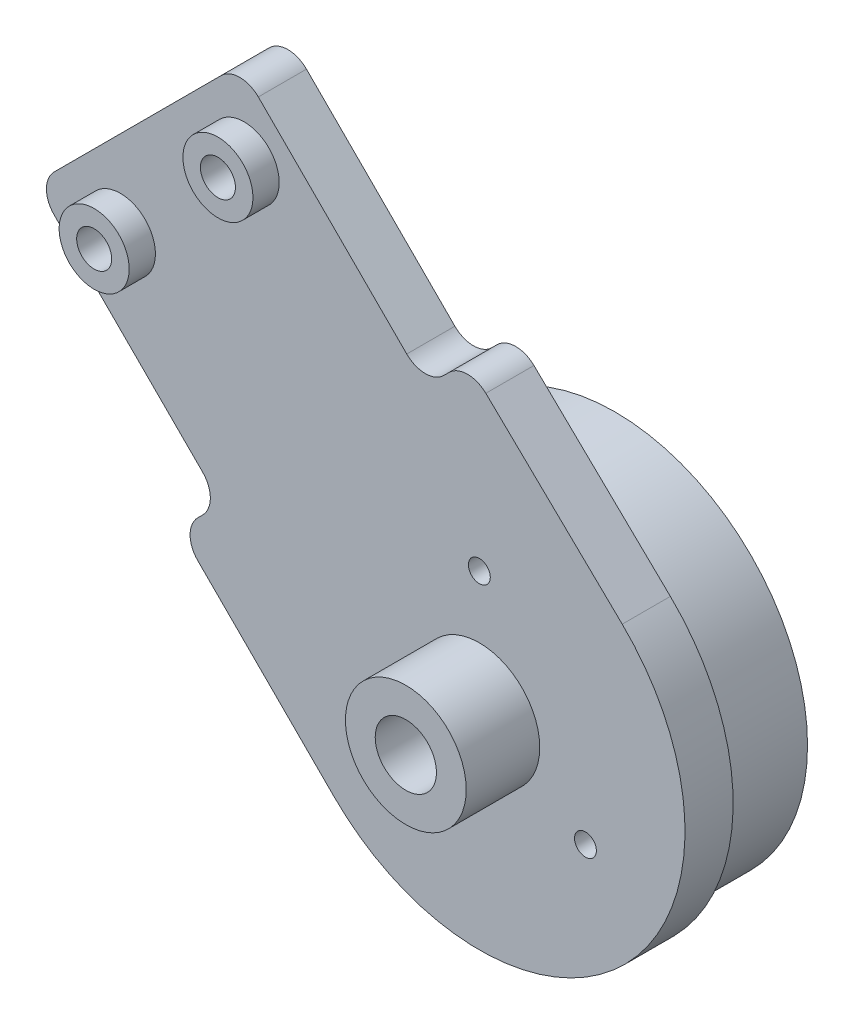
ISO-10303-21;
HEADER;
FILE_DESCRIPTION(('STEP AP214'),'2;1');
FILE_NAME('part.step','',(''),(''),'','','');
FILE_SCHEMA(('AUTOMOTIVE_DESIGN { 1 0 10303 214 1 1 1 1 }'));
ENDSEC;
DATA;
#1=APPLICATION_CONTEXT('core data for automotive mechanical design processes');
#2=APPLICATION_PROTOCOL_DEFINITION('international standard','automotive_design',2000,#1);
#3=PRODUCT_CONTEXT('',#1,'mechanical');
#4=PRODUCT('Part','Part','',(#3));
#5=PRODUCT_RELATED_PRODUCT_CATEGORY('part','',(#4));
#6=PRODUCT_DEFINITION_FORMATION('','',#4);
#7=PRODUCT_DEFINITION_CONTEXT('part definition',#1,'design');
#8=PRODUCT_DEFINITION('design','',#6,#7);
#9=PRODUCT_DEFINITION_SHAPE('','',#8);
#10=(LENGTH_UNIT() NAMED_UNIT(*) SI_UNIT(.MILLI.,.METRE.));
#11=(NAMED_UNIT(*) PLANE_ANGLE_UNIT() SI_UNIT($,.RADIAN.));
#12=(NAMED_UNIT(*) SI_UNIT($,.STERADIAN.) SOLID_ANGLE_UNIT());
#13=UNCERTAINTY_MEASURE_WITH_UNIT(LENGTH_MEASURE(1.E-05),#10,'distance_accuracy_value','');
#14=(GEOMETRIC_REPRESENTATION_CONTEXT(3) GLOBAL_UNCERTAINTY_ASSIGNED_CONTEXT((#13)) GLOBAL_UNIT_ASSIGNED_CONTEXT((#10,
#11,#12)) REPRESENTATION_CONTEXT('',''));
#15=CARTESIAN_POINT('',(0.,0.,0.));
#16=DIRECTION('',(0.,0.,1.));
#17=DIRECTION('',(1.,0.,0.));
#18=AXIS2_PLACEMENT_3D('',#15,#16,#17);
#19=CARTESIAN_POINT('',(0.,0.,2.75));
#20=DIRECTION('',(0.,0.,1.));
#21=DIRECTION('',(1.,0.,0.));
#22=AXIS2_PLACEMENT_3D('',#19,#20,#21);
#23=PLANE('',#22);
#24=CARTESIAN_POINT('',(100.,7.00000000000003,2.75));
#25=DIRECTION('',(0.,0.,1.));
#26=DIRECTION('',(1.,0.,0.));
#27=AXIS2_PLACEMENT_3D('',#24,#25,#26);
#28=CIRCLE('',#27,0.625000000000006);
#29=CARTESIAN_POINT('',(100.625,7.00000000000003,2.75));
#30=VERTEX_POINT('',#29);
#31=EDGE_CURVE('E237',#30,#30,#28,.T.);
#32=ORIENTED_EDGE('',*,*,#31,.F.);
#33=EDGE_LOOP('',(#32));
#34=FACE_BOUND('',#33,.T.);
#35=CARTESIAN_POINT('',(106.062177826491,-3.49999999999979,2.75));
#36=DIRECTION('',(0.,0.,1.));
#37=DIRECTION('',(1.,0.,0.));
#38=AXIS2_PLACEMENT_3D('',#35,#36,#37);
#39=CIRCLE('',#38,0.62500000000002);
#40=CARTESIAN_POINT('',(106.687177826491,-3.49999999999979,2.75));
#41=VERTEX_POINT('',#40);
#42=EDGE_CURVE('E540',#41,#41,#39,.T.);
#43=ORIENTED_EDGE('',*,*,#42,.F.);
#44=EDGE_LOOP('',(#43));
#45=FACE_BOUND('',#44,.T.);
#46=CARTESIAN_POINT('',(93.9378221735093,-3.50000000000014,2.75));
#47=DIRECTION('',(0.,0.,1.));
#48=DIRECTION('',(1.,0.,0.));
#49=AXIS2_PLACEMENT_3D('',#46,#47,#48);
#50=CIRCLE('',#49,0.624999999999991);
#51=CARTESIAN_POINT('',(94.5628221735093,-3.50000000000014,2.75));
#52=VERTEX_POINT('',#51);
#53=EDGE_CURVE('E254',#52,#52,#50,.T.);
#54=ORIENTED_EDGE('',*,*,#53,.F.);
#55=EDGE_LOOP('',(#54));
#56=FACE_BOUND('',#55,.T.);
#57=CARTESIAN_POINT('',(86.5649711574558,20.5060966544101,2.75));
#58=DIRECTION('',(0.,0.,1.));
#59=DIRECTION('',(1.,0.,0.));
#60=AXIS2_PLACEMENT_3D('',#57,#58,#59);
#61=CIRCLE('',#60,2.);
#62=CARTESIAN_POINT('',(88.5649711574558,20.5060966544101,2.75));
#63=VERTEX_POINT('',#62);
#64=EDGE_CURVE('E260',#63,#63,#61,.T.);
#65=ORIENTED_EDGE('',*,*,#64,.F.);
#66=EDGE_LOOP('',(#65));
#67=FACE_BOUND('',#66,.T.);
#68=DIRECTION('',(-0.707106781186544,-0.707106781186551,0.));
#69=VECTOR('',#68,1.);
#70=CARTESIAN_POINT('',(41.1611652351685,-41.1611652351681,2.75));
#71=LINE('',#70,#69);
#72=CARTESIAN_POINT('',(84.1907991641736,1.86846869383737,2.75));
#73=VERTEX_POINT('',#72);
#74=CARTESIAN_POINT('',(83.9133207280061,1.59099025766978,2.75));
#75=VERTEX_POINT('',#74);
#76=EDGE_CURVE('E179',#73,#75,#71,.T.);
#77=ORIENTED_EDGE('',*,*,#76,.T.);
#78=CARTESIAN_POINT('',(84.9739808997859,0.530330085889964,2.75));
#79=DIRECTION('',(0.,0.,1.));
#80=DIRECTION('',(1.,0.,0.));
#81=AXIS2_PLACEMENT_3D('',#78,#79,#80);
#82=CIRCLE('',#81,1.5);
#83=CARTESIAN_POINT('',(83.913320728006,-0.53033008588986,2.75));
#84=VERTEX_POINT('',#83);
#85=EDGE_CURVE('E154',#75,#84,#82,.T.);
#86=ORIENTED_EDGE('',*,*,#85,.T.);
#87=DIRECTION('',(0.707106781186547,-0.707106781186548,0.));
#88=VECTOR('',#87,1.);
#89=CARTESIAN_POINT('',(41.6914953210581,41.6914953210581,2.75));
#90=LINE('',#89,#88);
#91=CARTESIAN_POINT('',(91.6914953210581,-8.30850467894189,2.75));
#92=VERTEX_POINT('',#91);
#93=EDGE_CURVE('E146',#84,#92,#90,.T.);
#94=ORIENTED_EDGE('',*,*,#93,.T.);
#95=CARTESIAN_POINT('',(100.,0.,2.75));
#96=DIRECTION('',(0.,0.,1.));
#97=DIRECTION('',(1.,0.,0.));
#98=AXIS2_PLACEMENT_3D('',#95,#96,#97);
#99=CIRCLE('',#98,11.75);
#100=CARTESIAN_POINT('',(108.163262954966,8.45125067242009,2.75));
#101=VERTEX_POINT('',#100);
#102=EDGE_CURVE('E151',#92,#101,#99,.T.);
#103=ORIENTED_EDGE('',*,*,#102,.T.);
#104=DIRECTION('',(0.719255376376175,-0.694745783401358,0.));
#105=VECTOR('',#104,1.);
#106=CARTESIAN_POINT('',(56.4304333103627,58.4212146650305,2.75));
#107=LINE('',#106,#105);
#108=CARTESIAN_POINT('',(100.370597127916,15.9783709451608,2.75));
#109=VERTEX_POINT('',#108);
#110=EDGE_CURVE('E168',#109,#101,#107,.T.);
#111=ORIENTED_EDGE('',*,*,#110,.F.);
#112=CARTESIAN_POINT('',(99.3284784528139,14.8994878805966,2.75));
#113=DIRECTION('',(0.,0.,1.));
#114=DIRECTION('',(1.,0.,0.));
#115=AXIS2_PLACEMENT_3D('',#112,#113,#114);
#116=CIRCLE('',#115,1.5);
#117=CARTESIAN_POINT('',(98.2620899578572,15.9543886237112,2.75));
#118=VERTEX_POINT('',#117);
#119=EDGE_CURVE('E197',#109,#118,#116,.T.);
#120=ORIENTED_EDGE('',*,*,#119,.T.);
#121=DIRECTION('',(0.703267162076436,0.710925663304509,0.));
#122=VECTOR('',#121,1.);
#123=CARTESIAN_POINT('',(41.6864371230131,-41.2373667822174,2.75));
#124=LINE('',#123,#122);
#125=CARTESIAN_POINT('',(97.9793502073653,15.6685698687626,2.75));
#126=VERTEX_POINT('',#125);
#127=EDGE_CURVE('E286',#126,#118,#124,.T.);
#128=ORIENTED_EDGE('',*,*,#127,.F.);
#129=CARTESIAN_POINT('',(96.9129617124085,16.7234706118772,2.75));
#130=DIRECTION('',(0.,0.,1.));
#131=DIRECTION('',(1.,0.,0.));
#132=AXIS2_PLACEMENT_3D('',#129,#130,#131);
#133=CIRCLE('',#132,1.5);
#134=CARTESIAN_POINT('',(95.8523015406287,15.6628104400974,2.75));
#135=VERTEX_POINT('',#134);
#136=EDGE_CURVE('E12',#126,#135,#133,.F.);
#137=ORIENTED_EDGE('',*,*,#136,.T.);
#138=DIRECTION('',(0.707106781186547,-0.707106781186548,0.));
#139=VECTOR('',#138,1.);
#140=CARTESIAN_POINT('',(55.7575559903631,55.757555990363,2.75));
#141=LINE('',#140,#139);
#142=CARTESIAN_POINT('',(87.3727796795128,24.1423323012133,2.75));
#143=VERTEX_POINT('',#142);
#144=EDGE_CURVE('E289',#143,#135,#141,.T.);
#145=ORIENTED_EDGE('',*,*,#144,.F.);
#146=CARTESIAN_POINT('',(86.312119507733,23.0816721294335,2.75));
#147=DIRECTION('',(0.,0.,1.));
#148=DIRECTION('',(1.,0.,0.));
#149=AXIS2_PLACEMENT_3D('',#146,#147,#148);
#150=CIRCLE('',#149,1.5);
#151=CARTESIAN_POINT('',(85.2514593359532,24.1423323012133,2.75));
#152=VERTEX_POINT('',#151);
#153=EDGE_CURVE('E199',#143,#152,#150,.T.);
#154=ORIENTED_EDGE('',*,*,#153,.T.);
#155=DIRECTION('',(0.707106781186547,0.707106781186548,0.));
#156=VECTOR('',#155,1.);
#157=CARTESIAN_POINT('',(30.55456351737,-30.55456351737,2.75));
#158=LINE('',#157,#156);
#159=CARTESIAN_POINT('',(75.7055177899351,14.5963907551952,2.75));
#160=VERTEX_POINT('',#159);
#161=EDGE_CURVE('E292',#160,#152,#158,.T.);
#162=ORIENTED_EDGE('',*,*,#161,.F.);
#163=CARTESIAN_POINT('',(76.7661779617149,13.5357305834154,2.75));
#164=DIRECTION('',(0.,0.,1.));
#165=DIRECTION('',(1.,0.,0.));
#166=AXIS2_PLACEMENT_3D('',#163,#164,#165);
#167=CIRCLE('',#166,1.5);
#168=CARTESIAN_POINT('',(75.7055177899351,12.4750704116355,2.75));
#169=VERTEX_POINT('',#168);
#170=EDGE_CURVE('E60',#160,#169,#167,.T.);
#171=ORIENTED_EDGE('',*,*,#170,.T.);
#172=DIRECTION('',(-0.707106781186547,0.707106781186548,0.));
#173=VECTOR('',#172,1.);
#174=CARTESIAN_POINT('',(44.0902941007854,44.0902941007853,2.75));
#175=LINE('',#174,#173);
#176=CARTESIAN_POINT('',(84.1907991641736,3.989789037397,2.75));
#177=VERTEX_POINT('',#176);
#178=EDGE_CURVE('E295',#177,#169,#175,.T.);
#179=ORIENTED_EDGE('',*,*,#178,.F.);
#180=CARTESIAN_POINT('',(83.1301389923938,2.92912886561718,2.75));
#181=DIRECTION('',(0.,0.,1.));
#182=DIRECTION('',(1.,0.,0.));
#183=AXIS2_PLACEMENT_3D('',#180,#181,#182);
#184=CIRCLE('',#183,1.5);
#185=EDGE_CURVE('E226',#177,#73,#184,.F.);
#186=ORIENTED_EDGE('',*,*,#185,.T.);
#187=EDGE_LOOP('',(#77,#86,#94,#103,#111,#120,#128,#137,#145,#154,#162,#171,#179,#186));
#188=FACE_BOUND('',#187,.T.);
#189=CARTESIAN_POINT('',(79.4939033455903,13.4350288425446,2.75));
#190=DIRECTION('',(0.,0.,1.));
#191=DIRECTION('',(1.,0.,0.));
#192=AXIS2_PLACEMENT_3D('',#189,#190,#191);
#193=CIRCLE('',#192,2.);
#194=CARTESIAN_POINT('',(81.4939033455903,13.4350288425446,2.75));
#195=VERTEX_POINT('',#194);
#196=EDGE_CURVE('E269',#195,#195,#193,.T.);
#197=ORIENTED_EDGE('',*,*,#196,.F.);
#198=EDGE_LOOP('',(#197));
#199=FACE_BOUND('',#198,.T.);
#200=CARTESIAN_POINT('',(100.,0.,2.75));
#201=DIRECTION('',(0.,0.,1.));
#202=DIRECTION('',(1.,0.,0.));
#203=AXIS2_PLACEMENT_3D('',#200,#201,#202);
#204=CIRCLE('',#203,3.45);
#205=CARTESIAN_POINT('',(103.45,0.,2.75));
#206=VERTEX_POINT('',#205);
#207=EDGE_CURVE('E246',#206,#206,#204,.T.);
#208=ORIENTED_EDGE('',*,*,#207,.F.);
#209=EDGE_LOOP('',(#208));
#210=FACE_BOUND('',#209,.T.);
#211=ADVANCED_FACE('F43',(#34,#45,#56,#67,#188,#199,#210),#23,.T.);
#212=CARTESIAN_POINT('',(0.,0.,0.));
#213=DIRECTION('',(0.,0.,1.));
#214=DIRECTION('',(1.,0.,0.));
#215=AXIS2_PLACEMENT_3D('',#212,#213,#214);
#216=PLANE('',#215);
#217=DIRECTION('',(0.707106781186547,-0.707106781186548,0.));
#218=VECTOR('',#217,1.);
#219=CARTESIAN_POINT('',(41.6914953210581,41.6914953210581,0.));
#220=LINE('',#219,#218);
#221=CARTESIAN_POINT('',(83.913320728006,-0.53033008588986,0.));
#222=VERTEX_POINT('',#221);
#223=CARTESIAN_POINT('',(91.6914953210581,-8.30850467894189,0.));
#224=VERTEX_POINT('',#223);
#225=EDGE_CURVE('E172',#222,#224,#220,.T.);
#226=ORIENTED_EDGE('',*,*,#225,.F.);
#227=CARTESIAN_POINT('',(84.9739808997859,0.530330085889964,0.));
#228=DIRECTION('',(0.,0.,1.));
#229=DIRECTION('',(1.,0.,0.));
#230=AXIS2_PLACEMENT_3D('',#227,#228,#229);
#231=CIRCLE('',#230,1.5);
#232=CARTESIAN_POINT('',(83.9133207280061,1.59099025766978,0.));
#233=VERTEX_POINT('',#232);
#234=EDGE_CURVE('E190',#222,#233,#231,.F.);
#235=ORIENTED_EDGE('',*,*,#234,.T.);
#236=DIRECTION('',(-0.707106781186544,-0.707106781186551,0.));
#237=VECTOR('',#236,1.);
#238=CARTESIAN_POINT('',(41.1611652351685,-41.1611652351681,0.));
#239=LINE('',#238,#237);
#240=CARTESIAN_POINT('',(84.1907991641736,1.86846869383737,0.));
#241=VERTEX_POINT('',#240);
#242=EDGE_CURVE('E159',#241,#233,#239,.T.);
#243=ORIENTED_EDGE('',*,*,#242,.F.);
#244=CARTESIAN_POINT('',(83.1301389923938,2.92912886561718,0.));
#245=DIRECTION('',(0.,0.,1.));
#246=DIRECTION('',(1.,0.,0.));
#247=AXIS2_PLACEMENT_3D('',#244,#245,#246);
#248=CIRCLE('',#247,1.5);
#249=CARTESIAN_POINT('',(84.1907991641736,3.989789037397,0.));
#250=VERTEX_POINT('',#249);
#251=EDGE_CURVE('E224',#241,#250,#248,.T.);
#252=ORIENTED_EDGE('',*,*,#251,.T.);
#253=DIRECTION('',(-0.707106781186547,0.707106781186548,0.));
#254=VECTOR('',#253,1.);
#255=CARTESIAN_POINT('',(44.0902941007854,44.0902941007853,0.));
#256=LINE('',#255,#254);
#257=CARTESIAN_POINT('',(75.7055177899351,12.4750704116355,0.));
#258=VERTEX_POINT('',#257);
#259=EDGE_CURVE('E317',#250,#258,#256,.T.);
#260=ORIENTED_EDGE('',*,*,#259,.T.);
#261=CARTESIAN_POINT('',(76.7661779617149,13.5357305834154,0.));
#262=DIRECTION('',(0.,0.,1.));
#263=DIRECTION('',(1.,0.,0.));
#264=AXIS2_PLACEMENT_3D('',#261,#262,#263);
#265=CIRCLE('',#264,1.5);
#266=CARTESIAN_POINT('',(75.7055177899351,14.5963907551952,0.));
#267=VERTEX_POINT('',#266);
#268=EDGE_CURVE('E188',#258,#267,#265,.F.);
#269=ORIENTED_EDGE('',*,*,#268,.T.);
#270=DIRECTION('',(0.707106781186547,0.707106781186548,0.));
#271=VECTOR('',#270,1.);
#272=CARTESIAN_POINT('',(30.55456351737,-30.55456351737,0.));
#273=LINE('',#272,#271);
#274=CARTESIAN_POINT('',(85.2514593359532,24.1423323012133,0.));
#275=VERTEX_POINT('',#274);
#276=EDGE_CURVE('E314',#267,#275,#273,.T.);
#277=ORIENTED_EDGE('',*,*,#276,.T.);
#278=CARTESIAN_POINT('',(86.312119507733,23.0816721294335,0.));
#279=DIRECTION('',(0.,0.,1.));
#280=DIRECTION('',(1.,0.,0.));
#281=AXIS2_PLACEMENT_3D('',#278,#279,#280);
#282=CIRCLE('',#281,1.5);
#283=CARTESIAN_POINT('',(87.3727796795128,24.1423323012133,0.));
#284=VERTEX_POINT('',#283);
#285=EDGE_CURVE('E186',#275,#284,#282,.F.);
#286=ORIENTED_EDGE('',*,*,#285,.T.);
#287=DIRECTION('',(0.707106781186547,-0.707106781186548,0.));
#288=VECTOR('',#287,1.);
#289=CARTESIAN_POINT('',(55.7575559903631,55.757555990363,0.));
#290=LINE('',#289,#288);
#291=CARTESIAN_POINT('',(95.8523015406287,15.6628104400974,0.));
#292=VERTEX_POINT('',#291);
#293=EDGE_CURVE('E311',#284,#292,#290,.T.);
#294=ORIENTED_EDGE('',*,*,#293,.T.);
#295=CARTESIAN_POINT('',(96.9129617124085,16.7234706118772,0.));
#296=DIRECTION('',(0.,0.,1.));
#297=DIRECTION('',(1.,0.,0.));
#298=AXIS2_PLACEMENT_3D('',#295,#296,#297);
#299=CIRCLE('',#298,1.5);
#300=CARTESIAN_POINT('',(97.9793502073653,15.6685698687626,0.));
#301=VERTEX_POINT('',#300);
#302=EDGE_CURVE('E52',#292,#301,#299,.T.);
#303=ORIENTED_EDGE('',*,*,#302,.T.);
#304=DIRECTION('',(0.703267162076436,0.710925663304509,0.));
#305=VECTOR('',#304,1.);
#306=CARTESIAN_POINT('',(41.6864371230131,-41.2373667822174,0.));
#307=LINE('',#306,#305);
#308=CARTESIAN_POINT('',(98.2620899578572,15.9543886237112,0.));
#309=VERTEX_POINT('',#308);
#310=EDGE_CURVE('E308',#301,#309,#307,.T.);
#311=ORIENTED_EDGE('',*,*,#310,.T.);
#312=CARTESIAN_POINT('',(99.3284784528139,14.8994878805966,0.));
#313=DIRECTION('',(0.,0.,1.));
#314=DIRECTION('',(1.,0.,0.));
#315=AXIS2_PLACEMENT_3D('',#312,#313,#314);
#316=CIRCLE('',#315,1.5);
#317=CARTESIAN_POINT('',(100.370597127916,15.9783709451608,0.));
#318=VERTEX_POINT('',#317);
#319=EDGE_CURVE('E184',#309,#318,#316,.F.);
#320=ORIENTED_EDGE('',*,*,#319,.T.);
#321=DIRECTION('',(0.719255376376175,-0.694745783401358,0.));
#322=VECTOR('',#321,1.);
#323=CARTESIAN_POINT('',(56.4304333103627,58.4212146650305,0.));
#324=LINE('',#323,#322);
#325=CARTESIAN_POINT('',(108.163262954966,8.45125067242009,0.));
#326=VERTEX_POINT('',#325);
#327=EDGE_CURVE('E306',#318,#326,#324,.T.);
#328=ORIENTED_EDGE('',*,*,#327,.T.);
#329=CARTESIAN_POINT('',(100.,0.,0.));
#330=DIRECTION('',(0.,0.,1.));
#331=DIRECTION('',(1.,0.,0.));
#332=AXIS2_PLACEMENT_3D('',#329,#330,#331);
#333=CIRCLE('',#332,11.75);
#334=EDGE_CURVE('E304',#224,#326,#333,.T.);
#335=ORIENTED_EDGE('',*,*,#334,.F.);
#336=EDGE_LOOP('',(#226,#235,#243,#252,#260,#269,#277,#286,#294,#303,#311,#320,#328,#335));
#337=FACE_BOUND('',#336,.T.);
#338=CARTESIAN_POINT('',(86.5649711574558,20.5060966544101,0.));
#339=DIRECTION('',(0.,0.,1.));
#340=DIRECTION('',(1.,0.,0.));
#341=AXIS2_PLACEMENT_3D('',#338,#339,#340);
#342=CIRCLE('',#341,0.999999999999998);
#343=CARTESIAN_POINT('',(87.5649711574558,20.5060966544101,0.));
#344=VERTEX_POINT('',#343);
#345=EDGE_CURVE('E300',#344,#344,#342,.T.);
#346=ORIENTED_EDGE('',*,*,#345,.T.);
#347=EDGE_LOOP('',(#346));
#348=FACE_BOUND('',#347,.T.);
#349=CARTESIAN_POINT('',(79.4939033455903,13.4350288425446,0.));
#350=DIRECTION('',(0.,0.,1.));
#351=DIRECTION('',(1.,0.,0.));
#352=AXIS2_PLACEMENT_3D('',#349,#350,#351);
#353=CIRCLE('',#352,0.999999999999998);
#354=CARTESIAN_POINT('',(80.4939033455903,13.4350288425446,0.));
#355=VERTEX_POINT('',#354);
#356=EDGE_CURVE('E283',#355,#355,#353,.T.);
#357=ORIENTED_EDGE('',*,*,#356,.T.);
#358=EDGE_LOOP('',(#357));
#359=FACE_BOUND('',#358,.T.);
#360=CARTESIAN_POINT('',(100.,0.,0.));
#361=DIRECTION('',(0.,0.,1.));
#362=DIRECTION('',(1.,0.,0.));
#363=AXIS2_PLACEMENT_3D('',#360,#361,#362);
#364=CIRCLE('',#363,11.);
#365=CARTESIAN_POINT('',(111.,0.,0.));
#366=VERTEX_POINT('',#365);
#367=EDGE_CURVE('E174',#366,#366,#364,.F.);
#368=ORIENTED_EDGE('',*,*,#367,.F.);
#369=EDGE_LOOP('',(#368));
#370=FACE_BOUND('',#369,.T.);
#371=ADVANCED_FACE('F329',(#337,#348,#359,#370),#216,.F.);
#372=CARTESIAN_POINT('',(41.6914953210581,41.6914953210581,2.75));
#373=DIRECTION('',(0.707106781186548,0.707106781186547,0.));
#374=DIRECTION('',(-0.707106781186547,0.707106781186548,0.));
#375=AXIS2_PLACEMENT_3D('',#372,#373,#374);
#376=PLANE('',#375);
#377=ORIENTED_EDGE('',*,*,#93,.F.);
#378=DIRECTION('',(0.,0.,-1.));
#379=VECTOR('',#378,1.);
#380=CARTESIAN_POINT('',(83.913320728006,-0.53033008588986,2.75));
#381=LINE('',#380,#379);
#382=EDGE_CURVE('E177',#84,#222,#381,.T.);
#383=ORIENTED_EDGE('',*,*,#382,.T.);
#384=ORIENTED_EDGE('',*,*,#225,.T.);
#385=DIRECTION('',(0.,0.,-1.));
#386=VECTOR('',#385,1.);
#387=CARTESIAN_POINT('',(91.6914953210581,-8.30850467894189,2.75));
#388=LINE('',#387,#386);
#389=EDGE_CURVE('E165',#92,#224,#388,.T.);
#390=ORIENTED_EDGE('',*,*,#389,.F.);
#391=EDGE_LOOP('',(#377,#383,#384,#390));
#392=FACE_BOUND('',#391,.T.);
#393=ADVANCED_FACE('F170',(#392),#376,.F.);
#394=CARTESIAN_POINT('',(100.,0.,2.75));
#395=DIRECTION('',(0.,0.,-1.));
#396=DIRECTION('',(-1.,0.,0.));
#397=AXIS2_PLACEMENT_3D('',#394,#395,#396);
#398=CYLINDRICAL_SURFACE('',#397,11.75);
#399=ORIENTED_EDGE('',*,*,#334,.T.);
#400=DIRECTION('',(0.,0.,-1.));
#401=VECTOR('',#400,1.);
#402=CARTESIAN_POINT('',(108.163262954966,8.45125067242009,2.75));
#403=LINE('',#402,#401);
#404=EDGE_CURVE('E167',#101,#326,#403,.T.);
#405=ORIENTED_EDGE('',*,*,#404,.F.);
#406=ORIENTED_EDGE('',*,*,#102,.F.);
#407=ORIENTED_EDGE('',*,*,#389,.T.);
#408=EDGE_LOOP('',(#399,#405,#406,#407));
#409=FACE_BOUND('',#408,.T.);
#410=ADVANCED_FACE('F164',(#409),#398,.T.);
#411=CARTESIAN_POINT('',(56.4304333103627,58.4212146650305,2.75));
#412=DIRECTION('',(0.694745783401358,0.719255376376175,0.));
#413=DIRECTION('',(-0.719255376376175,0.694745783401358,0.));
#414=AXIS2_PLACEMENT_3D('',#411,#412,#413);
#415=PLANE('',#414);
#416=ORIENTED_EDGE('',*,*,#327,.F.);
#417=DIRECTION('',(0.,0.,-1.));
#418=VECTOR('',#417,1.);
#419=CARTESIAN_POINT('',(100.370597127916,15.9783709451608,2.75));
#420=LINE('',#419,#418);
#421=EDGE_CURVE('E222',#318,#109,#420,.F.);
#422=ORIENTED_EDGE('',*,*,#421,.T.);
#423=ORIENTED_EDGE('',*,*,#110,.T.);
#424=ORIENTED_EDGE('',*,*,#404,.T.);
#425=EDGE_LOOP('',(#416,#422,#423,#424));
#426=FACE_BOUND('',#425,.T.);
#427=ADVANCED_FACE('F334',(#426),#415,.T.);
#428=CARTESIAN_POINT('',(41.6864371230131,-41.2373667822174,2.75));
#429=DIRECTION('',(-0.710925663304509,0.703267162076436,0.));
#430=DIRECTION('',(-0.703267162076436,-0.710925663304509,0.));
#431=AXIS2_PLACEMENT_3D('',#428,#429,#430);
#432=PLANE('',#431);
#433=ORIENTED_EDGE('',*,*,#127,.T.);
#434=DIRECTION('',(0.,0.,-1.));
#435=VECTOR('',#434,1.);
#436=CARTESIAN_POINT('',(98.2620899578572,15.9543886237112,2.75));
#437=LINE('',#436,#435);
#438=EDGE_CURVE('E219',#118,#309,#437,.T.);
#439=ORIENTED_EDGE('',*,*,#438,.T.);
#440=ORIENTED_EDGE('',*,*,#310,.F.);
#441=DIRECTION('',(0.,0.,-1.));
#442=VECTOR('',#441,1.);
#443=CARTESIAN_POINT('',(97.9793502073653,15.6685698687625,2.75));
#444=LINE('',#443,#442);
#445=EDGE_CURVE('E217',#301,#126,#444,.F.);
#446=ORIENTED_EDGE('',*,*,#445,.T.);
#447=EDGE_LOOP('',(#433,#439,#440,#446));
#448=FACE_BOUND('',#447,.T.);
#449=ADVANCED_FACE('F342',(#448),#432,.T.);
#450=CARTESIAN_POINT('',(55.7575559903631,55.757555990363,2.75));
#451=DIRECTION('',(0.707106781186548,0.707106781186547,0.));
#452=DIRECTION('',(-0.707106781186547,0.707106781186548,0.));
#453=AXIS2_PLACEMENT_3D('',#450,#451,#452);
#454=PLANE('',#453);
#455=ORIENTED_EDGE('',*,*,#293,.F.);
#456=DIRECTION('',(0.,0.,-1.));
#457=VECTOR('',#456,1.);
#458=CARTESIAN_POINT('',(87.3727796795128,24.1423323012133,2.75));
#459=LINE('',#458,#457);
#460=EDGE_CURVE('E215',#284,#143,#459,.F.);
#461=ORIENTED_EDGE('',*,*,#460,.T.);
#462=ORIENTED_EDGE('',*,*,#144,.T.);
#463=DIRECTION('',(0.,0.,-1.));
#464=VECTOR('',#463,1.);
#465=CARTESIAN_POINT('',(95.8523015406287,15.6628104400974,0.));
#466=LINE('',#465,#464);
#467=EDGE_CURVE('E212',#135,#292,#466,.T.);
#468=ORIENTED_EDGE('',*,*,#467,.T.);
#469=EDGE_LOOP('',(#455,#461,#462,#468));
#470=FACE_BOUND('',#469,.T.);
#471=ADVANCED_FACE('F349',(#470),#454,.T.);
#472=CARTESIAN_POINT('',(30.55456351737,-30.55456351737,2.75));
#473=DIRECTION('',(-0.707106781186548,0.707106781186547,0.));
#474=DIRECTION('',(-0.707106781186547,-0.707106781186548,0.));
#475=AXIS2_PLACEMENT_3D('',#472,#473,#474);
#476=PLANE('',#475);
#477=ORIENTED_EDGE('',*,*,#276,.F.);
#478=DIRECTION('',(0.,0.,-1.));
#479=VECTOR('',#478,1.);
#480=CARTESIAN_POINT('',(75.7055177899351,14.5963907551952,2.75));
#481=LINE('',#480,#479);
#482=EDGE_CURVE('E210',#267,#160,#481,.F.);
#483=ORIENTED_EDGE('',*,*,#482,.T.);
#484=ORIENTED_EDGE('',*,*,#161,.T.);
#485=DIRECTION('',(0.,0.,-1.));
#486=VECTOR('',#485,1.);
#487=CARTESIAN_POINT('',(85.2514593359532,24.1423323012133,2.75));
#488=LINE('',#487,#486);
#489=EDGE_CURVE('E207',#152,#275,#488,.T.);
#490=ORIENTED_EDGE('',*,*,#489,.T.);
#491=EDGE_LOOP('',(#477,#483,#484,#490));
#492=FACE_BOUND('',#491,.T.);
#493=ADVANCED_FACE('F358',(#492),#476,.T.);
#494=CARTESIAN_POINT('',(44.0902941007854,44.0902941007853,2.75));
#495=DIRECTION('',(-0.707106781186548,-0.707106781186547,0.));
#496=DIRECTION('',(0.707106781186547,-0.707106781186548,0.));
#497=AXIS2_PLACEMENT_3D('',#494,#495,#496);
#498=PLANE('',#497);
#499=ORIENTED_EDGE('',*,*,#259,.F.);
#500=DIRECTION('',(0.,0.,-1.));
#501=VECTOR('',#500,1.);
#502=CARTESIAN_POINT('',(84.1907991641736,3.989789037397,2.75));
#503=LINE('',#502,#501);
#504=EDGE_CURVE('E67',#250,#177,#503,.F.);
#505=ORIENTED_EDGE('',*,*,#504,.T.);
#506=ORIENTED_EDGE('',*,*,#178,.T.);
#507=DIRECTION('',(0.,0.,-1.));
#508=VECTOR('',#507,1.);
#509=CARTESIAN_POINT('',(75.7055177899351,12.4750704116355,2.75));
#510=LINE('',#509,#508);
#511=EDGE_CURVE('E203',#169,#258,#510,.T.);
#512=ORIENTED_EDGE('',*,*,#511,.T.);
#513=EDGE_LOOP('',(#499,#505,#506,#512));
#514=FACE_BOUND('',#513,.T.);
#515=ADVANCED_FACE('F363',(#514),#498,.T.);
#516=CARTESIAN_POINT('',(86.5649711574558,20.5060966544101,2.75));
#517=DIRECTION('',(0.,0.,-1.));
#518=DIRECTION('',(-1.,0.,0.));
#519=AXIS2_PLACEMENT_3D('',#516,#517,#518);
#520=CYLINDRICAL_SURFACE('',#519,0.999999999999998);
#521=ORIENTED_EDGE('',*,*,#345,.F.);
#522=EDGE_LOOP('',(#521));
#523=FACE_BOUND('',#522,.T.);
#524=CARTESIAN_POINT('',(86.5649711574558,20.5060966544101,4.25));
#525=DIRECTION('',(0.,0.,1.));
#526=DIRECTION('',(1.,0.,0.));
#527=AXIS2_PLACEMENT_3D('',#524,#525,#526);
#528=CIRCLE('',#527,0.999999999999998);
#529=CARTESIAN_POINT('',(87.5649711574558,20.5060966544101,4.25));
#530=VERTEX_POINT('',#529);
#531=EDGE_CURVE('E232',#530,#530,#528,.T.);
#532=ORIENTED_EDGE('',*,*,#531,.T.);
#533=EDGE_LOOP('',(#532));
#534=FACE_BOUND('',#533,.T.);
#535=ADVANCED_FACE('F397',(#523,#534),#520,.F.);
#536=CARTESIAN_POINT('',(79.4939033455903,13.4350288425446,2.75));
#537=DIRECTION('',(0.,0.,-1.));
#538=DIRECTION('',(-1.,0.,0.));
#539=AXIS2_PLACEMENT_3D('',#536,#537,#538);
#540=CYLINDRICAL_SURFACE('',#539,0.999999999999998);
#541=ORIENTED_EDGE('',*,*,#356,.F.);
#542=EDGE_LOOP('',(#541));
#543=FACE_BOUND('',#542,.T.);
#544=CARTESIAN_POINT('',(79.4939033455903,13.4350288425446,4.25));
#545=DIRECTION('',(0.,0.,1.));
#546=DIRECTION('',(1.,0.,0.));
#547=AXIS2_PLACEMENT_3D('',#544,#545,#546);
#548=CIRCLE('',#547,0.999999999999998);
#549=CARTESIAN_POINT('',(80.4939033455903,13.4350288425446,4.25));
#550=VERTEX_POINT('',#549);
#551=EDGE_CURVE('E264',#550,#550,#548,.T.);
#552=ORIENTED_EDGE('',*,*,#551,.T.);
#553=EDGE_LOOP('',(#552));
#554=FACE_BOUND('',#553,.T.);
#555=ADVANCED_FACE('F394',(#543,#554),#540,.F.);
#556=CARTESIAN_POINT('',(41.1611652351685,-41.1611652351681,2.75));
#557=DIRECTION('',(0.707106781186551,-0.707106781186544,0.));
#558=DIRECTION('',(0.707106781186544,0.707106781186551,0.));
#559=AXIS2_PLACEMENT_3D('',#556,#557,#558);
#560=PLANE('',#559);
#561=ORIENTED_EDGE('',*,*,#242,.T.);
#562=DIRECTION('',(0.,0.,-1.));
#563=VECTOR('',#562,1.);
#564=CARTESIAN_POINT('',(83.913320728006,1.59099025766978,2.75));
#565=LINE('',#564,#563);
#566=EDGE_CURVE('E195',#233,#75,#565,.F.);
#567=ORIENTED_EDGE('',*,*,#566,.T.);
#568=ORIENTED_EDGE('',*,*,#76,.F.);
#569=DIRECTION('',(0.,0.,-1.));
#570=VECTOR('',#569,1.);
#571=CARTESIAN_POINT('',(84.1907991641736,1.86846869383737,2.75));
#572=LINE('',#571,#570);
#573=EDGE_CURVE('E192',#73,#241,#572,.T.);
#574=ORIENTED_EDGE('',*,*,#573,.T.);
#575=EDGE_LOOP('',(#561,#567,#568,#574));
#576=FACE_BOUND('',#575,.T.);
#577=ADVANCED_FACE('F323',(#576),#560,.F.);
#578=CARTESIAN_POINT('',(100.,0.,-5.));
#579=DIRECTION('',(0.,0.,-1.));
#580=DIRECTION('',(-1.,0.,0.));
#581=AXIS2_PLACEMENT_3D('',#578,#579,#580);
#582=PLANE('',#581);
#583=CARTESIAN_POINT('',(100.,0.,-5.));
#584=DIRECTION('',(0.,0.,-1.));
#585=DIRECTION('',(-1.,0.,0.));
#586=AXIS2_PLACEMENT_3D('',#583,#584,#585);
#587=CIRCLE('',#586,11.);
#588=CARTESIAN_POINT('',(89.,0.,-5.));
#589=VERTEX_POINT('',#588);
#590=EDGE_CURVE('E278',#589,#589,#587,.T.);
#591=ORIENTED_EDGE('',*,*,#590,.T.);
#592=EDGE_LOOP('',(#591));
#593=FACE_BOUND('',#592,.T.);
#594=CARTESIAN_POINT('',(100.,0.,-5.));
#595=DIRECTION('',(0.,0.,-1.));
#596=DIRECTION('',(-1.,0.,0.));
#597=AXIS2_PLACEMENT_3D('',#594,#595,#596);
#598=CIRCLE('',#597,9.99999999999999);
#599=CARTESIAN_POINT('',(90.,0.,-5.));
#600=VERTEX_POINT('',#599);
#601=EDGE_CURVE('E273',#600,#600,#598,.T.);
#602=ORIENTED_EDGE('',*,*,#601,.F.);
#603=EDGE_LOOP('',(#602));
#604=FACE_BOUND('',#603,.T.);
#605=ADVANCED_FACE('F393',(#593,#604),#582,.T.);
#606=CARTESIAN_POINT('',(100.,0.,-5.));
#607=DIRECTION('',(0.,0.,1.));
#608=DIRECTION('',(1.,0.,0.));
#609=AXIS2_PLACEMENT_3D('',#606,#607,#608);
#610=CYLINDRICAL_SURFACE('',#609,11.);
#611=ORIENTED_EDGE('',*,*,#590,.F.);
#612=EDGE_LOOP('',(#611));
#613=FACE_BOUND('',#612,.T.);
#614=ORIENTED_EDGE('',*,*,#367,.T.);
#615=EDGE_LOOP('',(#614));
#616=FACE_BOUND('',#615,.T.);
#617=ADVANCED_FACE('F441',(#613,#616),#610,.T.);
#618=CARTESIAN_POINT('',(100.,0.,1.75));
#619=DIRECTION('',(0.,0.,1.));
#620=DIRECTION('',(1.,0.,0.));
#621=AXIS2_PLACEMENT_3D('',#618,#619,#620);
#622=PLANE('',#621);
#623=CARTESIAN_POINT('',(100.,7.00000000000003,1.75));
#624=DIRECTION('',(0.,0.,1.));
#625=DIRECTION('',(1.,0.,0.));
#626=AXIS2_PLACEMENT_3D('',#623,#624,#625);
#627=CIRCLE('',#626,0.625000000000006);
#628=CARTESIAN_POINT('',(100.625,7.00000000000003,1.75));
#629=VERTEX_POINT('',#628);
#630=EDGE_CURVE('E47',#629,#629,#627,.T.);
#631=ORIENTED_EDGE('',*,*,#630,.T.);
#632=EDGE_LOOP('',(#631));
#633=FACE_BOUND('',#632,.T.);
#634=CARTESIAN_POINT('',(106.062177826491,-3.49999999999979,1.75));
#635=DIRECTION('',(0.,0.,1.));
#636=DIRECTION('',(1.,0.,0.));
#637=AXIS2_PLACEMENT_3D('',#634,#635,#636);
#638=CIRCLE('',#637,0.62500000000002);
#639=CARTESIAN_POINT('',(106.687177826491,-3.49999999999979,1.75));
#640=VERTEX_POINT('',#639);
#641=EDGE_CURVE('E236',#640,#640,#638,.T.);
#642=ORIENTED_EDGE('',*,*,#641,.T.);
#643=EDGE_LOOP('',(#642));
#644=FACE_BOUND('',#643,.T.);
#645=CARTESIAN_POINT('',(93.9378221735093,-3.50000000000014,1.75));
#646=DIRECTION('',(0.,0.,1.));
#647=DIRECTION('',(1.,0.,0.));
#648=AXIS2_PLACEMENT_3D('',#645,#646,#647);
#649=CIRCLE('',#648,0.624999999999991);
#650=CARTESIAN_POINT('',(94.5628221735093,-3.50000000000014,1.75));
#651=VERTEX_POINT('',#650);
#652=EDGE_CURVE('E234',#651,#651,#649,.T.);
#653=ORIENTED_EDGE('',*,*,#652,.T.);
#654=EDGE_LOOP('',(#653));
#655=FACE_BOUND('',#654,.T.);
#656=CARTESIAN_POINT('',(100.,0.,1.75));
#657=DIRECTION('',(0.,0.,1.));
#658=DIRECTION('',(1.,0.,0.));
#659=AXIS2_PLACEMENT_3D('',#656,#657,#658);
#660=CIRCLE('',#659,1.75);
#661=CARTESIAN_POINT('',(98.25,0.,1.75));
#662=VERTEX_POINT('',#661);
#663=EDGE_CURVE('E229',#662,#662,#660,.F.);
#664=ORIENTED_EDGE('',*,*,#663,.F.);
#665=EDGE_LOOP('',(#664));
#666=FACE_BOUND('',#665,.T.);
#667=CARTESIAN_POINT('',(100.,0.,1.75));
#668=DIRECTION('',(0.,0.,1.));
#669=DIRECTION('',(1.,0.,0.));
#670=AXIS2_PLACEMENT_3D('',#667,#668,#669);
#671=CIRCLE('',#670,9.99999999999999);
#672=CARTESIAN_POINT('',(110.,0.,1.75));
#673=VERTEX_POINT('',#672);
#674=EDGE_CURVE('E281',#673,#673,#671,.T.);
#675=ORIENTED_EDGE('',*,*,#674,.F.);
#676=EDGE_LOOP('',(#675));
#677=FACE_BOUND('',#676,.T.);
#678=ADVANCED_FACE('F388',(#633,#644,#655,#666,#677),#622,.F.);
#679=CARTESIAN_POINT('',(100.,0.,2.75));
#680=DIRECTION('',(0.,0.,-1.));
#681=DIRECTION('',(-1.,0.,0.));
#682=AXIS2_PLACEMENT_3D('',#679,#680,#681);
#683=CYLINDRICAL_SURFACE('',#682,9.99999999999999);
#684=ORIENTED_EDGE('',*,*,#674,.T.);
#685=EDGE_LOOP('',(#684));
#686=FACE_BOUND('',#685,.T.);
#687=ORIENTED_EDGE('',*,*,#601,.T.);
#688=EDGE_LOOP('',(#687));
#689=FACE_BOUND('',#688,.T.);
#690=ADVANCED_FACE('F374',(#686,#689),#683,.F.);
#691=CARTESIAN_POINT('',(84.9739808997859,0.530330085889964,2.75));
#692=DIRECTION('',(0.,0.,-1.));
#693=DIRECTION('',(-1.,0.,0.));
#694=AXIS2_PLACEMENT_3D('',#691,#692,#693);
#695=CYLINDRICAL_SURFACE('',#694,1.5);
#696=ORIENTED_EDGE('',*,*,#85,.F.);
#697=ORIENTED_EDGE('',*,*,#566,.F.);
#698=ORIENTED_EDGE('',*,*,#234,.F.);
#699=ORIENTED_EDGE('',*,*,#382,.F.);
#700=EDGE_LOOP('',(#696,#697,#698,#699));
#701=FACE_BOUND('',#700,.T.);
#702=ADVANCED_FACE('F328',(#701),#695,.T.);
#703=CARTESIAN_POINT('',(83.1301389923938,2.92912886561718,2.75));
#704=DIRECTION('',(0.,0.,-1.));
#705=DIRECTION('',(-1.,0.,0.));
#706=AXIS2_PLACEMENT_3D('',#703,#704,#705);
#707=CYLINDRICAL_SURFACE('',#706,1.5);
#708=ORIENTED_EDGE('',*,*,#185,.F.);
#709=ORIENTED_EDGE('',*,*,#504,.F.);
#710=ORIENTED_EDGE('',*,*,#251,.F.);
#711=ORIENTED_EDGE('',*,*,#573,.F.);
#712=EDGE_LOOP('',(#708,#709,#710,#711));
#713=FACE_BOUND('',#712,.T.);
#714=ADVANCED_FACE('F366',(#713),#707,.F.);
#715=CARTESIAN_POINT('',(76.7661779617149,13.5357305834154,2.75));
#716=DIRECTION('',(0.,0.,-1.));
#717=DIRECTION('',(-1.,0.,0.));
#718=AXIS2_PLACEMENT_3D('',#715,#716,#717);
#719=CYLINDRICAL_SURFACE('',#718,1.5);
#720=ORIENTED_EDGE('',*,*,#170,.F.);
#721=ORIENTED_EDGE('',*,*,#482,.F.);
#722=ORIENTED_EDGE('',*,*,#268,.F.);
#723=ORIENTED_EDGE('',*,*,#511,.F.);
#724=EDGE_LOOP('',(#720,#721,#722,#723));
#725=FACE_BOUND('',#724,.T.);
#726=ADVANCED_FACE('F362',(#725),#719,.T.);
#727=CARTESIAN_POINT('',(86.312119507733,23.0816721294335,2.75));
#728=DIRECTION('',(0.,0.,-1.));
#729=DIRECTION('',(-1.,0.,0.));
#730=AXIS2_PLACEMENT_3D('',#727,#728,#729);
#731=CYLINDRICAL_SURFACE('',#730,1.5);
#732=ORIENTED_EDGE('',*,*,#153,.F.);
#733=ORIENTED_EDGE('',*,*,#460,.F.);
#734=ORIENTED_EDGE('',*,*,#285,.F.);
#735=ORIENTED_EDGE('',*,*,#489,.F.);
#736=EDGE_LOOP('',(#732,#733,#734,#735));
#737=FACE_BOUND('',#736,.T.);
#738=ADVANCED_FACE('F355',(#737),#731,.T.);
#739=CARTESIAN_POINT('',(99.3284784528139,14.8994878805966,2.75));
#740=DIRECTION('',(0.,0.,-1.));
#741=DIRECTION('',(-1.,0.,0.));
#742=AXIS2_PLACEMENT_3D('',#739,#740,#741);
#743=CYLINDRICAL_SURFACE('',#742,1.5);
#744=ORIENTED_EDGE('',*,*,#119,.F.);
#745=ORIENTED_EDGE('',*,*,#421,.F.);
#746=ORIENTED_EDGE('',*,*,#319,.F.);
#747=ORIENTED_EDGE('',*,*,#438,.F.);
#748=EDGE_LOOP('',(#744,#745,#746,#747));
#749=FACE_BOUND('',#748,.T.);
#750=ADVANCED_FACE('F339',(#749),#743,.T.);
#751=CARTESIAN_POINT('',(96.9129617124085,16.7234706118772,2.75));
#752=DIRECTION('',(0.,0.,1.));
#753=DIRECTION('',(1.,0.,0.));
#754=AXIS2_PLACEMENT_3D('',#751,#752,#753);
#755=CYLINDRICAL_SURFACE('',#754,1.5);
#756=ORIENTED_EDGE('',*,*,#136,.F.);
#757=ORIENTED_EDGE('',*,*,#445,.F.);
#758=ORIENTED_EDGE('',*,*,#302,.F.);
#759=ORIENTED_EDGE('',*,*,#467,.F.);
#760=EDGE_LOOP('',(#756,#757,#758,#759));
#761=FACE_BOUND('',#760,.T.);
#762=ADVANCED_FACE('F45',(#761),#755,.F.);
#763=CARTESIAN_POINT('',(79.4939033455903,13.4350288425446,4.25));
#764=DIRECTION('',(0.,0.,1.));
#765=DIRECTION('',(1.,0.,0.));
#766=AXIS2_PLACEMENT_3D('',#763,#764,#765);
#767=PLANE('',#766);
#768=CARTESIAN_POINT('',(79.4939033455903,13.4350288425446,4.25));
#769=DIRECTION('',(0.,0.,1.));
#770=DIRECTION('',(1.,0.,0.));
#771=AXIS2_PLACEMENT_3D('',#768,#769,#770);
#772=CIRCLE('',#771,2.);
#773=CARTESIAN_POINT('',(81.4939033455903,13.4350288425446,4.25));
#774=VERTEX_POINT('',#773);
#775=EDGE_CURVE('E270',#774,#774,#772,.T.);
#776=ORIENTED_EDGE('',*,*,#775,.T.);
#777=EDGE_LOOP('',(#776));
#778=FACE_BOUND('',#777,.T.);
#779=ORIENTED_EDGE('',*,*,#551,.F.);
#780=EDGE_LOOP('',(#779));
#781=FACE_BOUND('',#780,.T.);
#782=ADVANCED_FACE('F425',(#778,#781),#767,.T.);
#783=CARTESIAN_POINT('',(79.4939033455903,13.4350288425446,4.25));
#784=DIRECTION('',(0.,0.,-1.));
#785=DIRECTION('',(-1.,0.,0.));
#786=AXIS2_PLACEMENT_3D('',#783,#784,#785);
#787=CYLINDRICAL_SURFACE('',#786,2.);
#788=ORIENTED_EDGE('',*,*,#775,.F.);
#789=EDGE_LOOP('',(#788));
#790=FACE_BOUND('',#789,.T.);
#791=ORIENTED_EDGE('',*,*,#196,.T.);
#792=EDGE_LOOP('',(#791));
#793=FACE_BOUND('',#792,.T.);
#794=ADVANCED_FACE('F426',(#790,#793),#787,.T.);
#795=CARTESIAN_POINT('',(86.5649711574558,20.5060966544101,4.25));
#796=DIRECTION('',(0.,0.,1.));
#797=DIRECTION('',(1.,0.,0.));
#798=AXIS2_PLACEMENT_3D('',#795,#796,#797);
#799=PLANE('',#798);
#800=CARTESIAN_POINT('',(86.5649711574558,20.5060966544101,4.25));
#801=DIRECTION('',(0.,0.,1.));
#802=DIRECTION('',(1.,0.,0.));
#803=AXIS2_PLACEMENT_3D('',#800,#801,#802);
#804=CIRCLE('',#803,2.);
#805=CARTESIAN_POINT('',(88.5649711574558,20.5060966544101,4.25));
#806=VERTEX_POINT('',#805);
#807=EDGE_CURVE('E261',#806,#806,#804,.T.);
#808=ORIENTED_EDGE('',*,*,#807,.T.);
#809=EDGE_LOOP('',(#808));
#810=FACE_BOUND('',#809,.T.);
#811=ORIENTED_EDGE('',*,*,#531,.F.);
#812=EDGE_LOOP('',(#811));
#813=FACE_BOUND('',#812,.T.);
#814=ADVANCED_FACE('F432',(#810,#813),#799,.T.);
#815=CARTESIAN_POINT('',(86.5649711574558,20.5060966544101,4.25));
#816=DIRECTION('',(0.,0.,-1.));
#817=DIRECTION('',(-1.,0.,0.));
#818=AXIS2_PLACEMENT_3D('',#815,#816,#817);
#819=CYLINDRICAL_SURFACE('',#818,2.);
#820=ORIENTED_EDGE('',*,*,#807,.F.);
#821=EDGE_LOOP('',(#820));
#822=FACE_BOUND('',#821,.T.);
#823=ORIENTED_EDGE('',*,*,#64,.T.);
#824=EDGE_LOOP('',(#823));
#825=FACE_BOUND('',#824,.T.);
#826=ADVANCED_FACE('F437',(#822,#825),#819,.T.);
#827=CARTESIAN_POINT('',(100.,0.,7.5));
#828=DIRECTION('',(0.,0.,-1.));
#829=DIRECTION('',(-1.,0.,0.));
#830=AXIS2_PLACEMENT_3D('',#827,#828,#829);
#831=CYLINDRICAL_SURFACE('',#830,1.75);
#832=CARTESIAN_POINT('',(100.,0.,6.95));
#833=DIRECTION('',(0.,0.,1.));
#834=DIRECTION('',(1.,0.,0.));
#835=AXIS2_PLACEMENT_3D('',#832,#833,#834);
#836=CIRCLE('',#835,1.75);
#837=CARTESIAN_POINT('',(98.25,0.,6.95));
#838=VERTEX_POINT('',#837);
#839=EDGE_CURVE('E242',#838,#838,#836,.T.);
#840=CARTESIAN_POINT('',(98.25,0.,1.75));
#841=CARTESIAN_POINT('',(98.25,0.,1.80416666666667));
#842=CARTESIAN_POINT('',(98.25,0.,1.85833333333333));
#843=CARTESIAN_POINT('',(98.25,0.,1.96666666666667));
#844=CARTESIAN_POINT('',(98.25,0.,2.02083333333333));
#845=CARTESIAN_POINT('',(98.25,0.,2.12916666666667));
#846=CARTESIAN_POINT('',(98.25,0.,2.18333333333333));
#847=CARTESIAN_POINT('',(98.25,0.,2.29166666666667));
#848=CARTESIAN_POINT('',(98.25,0.,2.34583333333333));
#849=CARTESIAN_POINT('',(98.25,0.,2.45416666666667));
#850=CARTESIAN_POINT('',(98.25,0.,2.50833333333333));
#851=CARTESIAN_POINT('',(98.25,0.,2.61666666666667));
#852=CARTESIAN_POINT('',(98.25,0.,2.67083333333333));
#853=CARTESIAN_POINT('',(98.25,0.,2.77916666666667));
#854=CARTESIAN_POINT('',(98.25,0.,2.83333333333333));
#855=CARTESIAN_POINT('',(98.25,0.,2.94166666666667));
#856=CARTESIAN_POINT('',(98.25,0.,2.99583333333333));
#857=CARTESIAN_POINT('',(98.25,0.,3.10416666666667));
#858=CARTESIAN_POINT('',(98.25,0.,3.15833333333333));
#859=CARTESIAN_POINT('',(98.25,0.,3.26666666666667));
#860=CARTESIAN_POINT('',(98.25,0.,3.32083333333333));
#861=CARTESIAN_POINT('',(98.25,0.,3.42916666666667));
#862=CARTESIAN_POINT('',(98.25,0.,3.48333333333333));
#863=CARTESIAN_POINT('',(98.25,0.,3.59166666666667));
#864=CARTESIAN_POINT('',(98.25,0.,3.64583333333333));
#865=CARTESIAN_POINT('',(98.25,0.,3.75416666666667));
#866=CARTESIAN_POINT('',(98.25,0.,3.80833333333333));
#867=CARTESIAN_POINT('',(98.25,0.,3.91666666666667));
#868=CARTESIAN_POINT('',(98.25,0.,3.97083333333333));
#869=CARTESIAN_POINT('',(98.25,0.,4.07916666666667));
#870=CARTESIAN_POINT('',(98.25,0.,4.13333333333333));
#871=CARTESIAN_POINT('',(98.25,0.,4.24166666666667));
#872=CARTESIAN_POINT('',(98.25,0.,4.29583333333333));
#873=CARTESIAN_POINT('',(98.25,0.,4.40416666666667));
#874=CARTESIAN_POINT('',(98.25,0.,4.45833333333333));
#875=CARTESIAN_POINT('',(98.25,0.,4.56666666666667));
#876=CARTESIAN_POINT('',(98.25,0.,4.62083333333333));
#877=CARTESIAN_POINT('',(98.25,0.,4.72916666666667));
#878=CARTESIAN_POINT('',(98.25,0.,4.78333333333333));
#879=CARTESIAN_POINT('',(98.25,0.,4.89166666666667));
#880=CARTESIAN_POINT('',(98.25,0.,4.94583333333333));
#881=CARTESIAN_POINT('',(98.25,0.,5.05416666666667));
#882=CARTESIAN_POINT('',(98.25,0.,5.10833333333333));
#883=CARTESIAN_POINT('',(98.25,0.,5.21666666666667));
#884=CARTESIAN_POINT('',(98.25,0.,5.27083333333333));
#885=CARTESIAN_POINT('',(98.25,0.,5.37916666666667));
#886=CARTESIAN_POINT('',(98.25,0.,5.43333333333333));
#887=CARTESIAN_POINT('',(98.25,0.,5.54166666666667));
#888=CARTESIAN_POINT('',(98.25,0.,5.59583333333333));
#889=CARTESIAN_POINT('',(98.25,0.,5.70416666666667));
#890=CARTESIAN_POINT('',(98.25,0.,5.75833333333333));
#891=CARTESIAN_POINT('',(98.25,0.,5.86666666666667));
#892=CARTESIAN_POINT('',(98.25,0.,5.92083333333333));
#893=CARTESIAN_POINT('',(98.25,0.,6.02916666666667));
#894=CARTESIAN_POINT('',(98.25,0.,6.08333333333333));
#895=CARTESIAN_POINT('',(98.25,0.,6.19166666666667));
#896=CARTESIAN_POINT('',(98.25,0.,6.24583333333333));
#897=CARTESIAN_POINT('',(98.25,0.,6.35416666666667));
#898=CARTESIAN_POINT('',(98.25,0.,6.40833333333333));
#899=CARTESIAN_POINT('',(98.25,0.,6.51666666666667));
#900=CARTESIAN_POINT('',(98.25,0.,6.57083333333333));
#901=CARTESIAN_POINT('',(98.25,0.,6.67916666666667));
#902=CARTESIAN_POINT('',(98.25,0.,6.73333333333333));
#903=CARTESIAN_POINT('',(98.25,0.,6.84166666666667));
#904=CARTESIAN_POINT('',(98.25,0.,6.89583333333333));
#905=CARTESIAN_POINT('',(98.25,0.,6.95));
#906=B_SPLINE_CURVE_WITH_KNOTS('',3,(#840,#841,#842,#843,#844,#845,#846,#847,#848,#849,#850,
#851,#852,#853,#854,#855,#856,#857,#858,#859,#860,#861,#862,#863,#864,#865,#866,#867,#868,#869,
#870,#871,#872,#873,#874,#875,#876,#877,#878,#879,#880,#881,#882,#883,#884,#885,#886,#887,#888,
#889,#890,#891,#892,#893,#894,#895,#896,#897,#898,#899,#900,#901,#902,#903,#904,#905),
.UNSPECIFIED.,.F.,.F.,(4,2,2,2,2,2,2,2,2,2,2,2,2,2,2,2,2,2,2,2,2,2,2,2,2,2,2,2,2,2,2,2,4),(0.,
0.1625,0.325,0.4875,0.65,0.812500000000001,0.975,1.1375,1.3,1.4625,1.625,1.7875,1.95,2.1125,
2.275,2.4375,2.6,2.7625,2.925,3.0875,3.25,3.4125,3.575,3.7375,3.9,4.0625,4.225,4.3875,4.55,
4.7125,4.875,5.0375,5.2),.UNSPECIFIED.);
#907=EDGE_CURVE('BSEAM464',#662,#838,#906,.T.);
#908=ORIENTED_EDGE('',*,*,#663,.T.);
#909=ORIENTED_EDGE('',*,*,#839,.T.);
#910=ORIENTED_EDGE('',*,*,#907,.T.);
#911=ORIENTED_EDGE('',*,*,#907,.F.);
#912=EDGE_LOOP('',(#908,#910,#909,#911));
#913=FACE_BOUND('',#912,.T.);
#914=ADVANCED_FACE('F464',(#913),#831,.F.);
#915=CARTESIAN_POINT('',(100.,0.,6.95));
#916=DIRECTION('',(0.,0.,1.));
#917=DIRECTION('',(1.,0.,0.));
#918=AXIS2_PLACEMENT_3D('',#915,#916,#917);
#919=PLANE('',#918);
#920=CARTESIAN_POINT('',(100.,0.,6.95));
#921=DIRECTION('',(0.,0.,1.));
#922=DIRECTION('',(1.,0.,0.));
#923=AXIS2_PLACEMENT_3D('',#920,#921,#922);
#924=CIRCLE('',#923,3.45);
#925=CARTESIAN_POINT('',(103.45,0.,6.95));
#926=VERTEX_POINT('',#925);
#927=EDGE_CURVE('E233',#926,#926,#924,.T.);
#928=ORIENTED_EDGE('',*,*,#927,.T.);
#929=EDGE_LOOP('',(#928));
#930=FACE_BOUND('',#929,.T.);
#931=ORIENTED_EDGE('',*,*,#839,.F.);
#932=EDGE_LOOP('',(#931));
#933=FACE_BOUND('',#932,.T.);
#934=ADVANCED_FACE('F466',(#930,#933),#919,.T.);
#935=CARTESIAN_POINT('',(100.,0.,6.95));
#936=DIRECTION('',(0.,0.,-1.));
#937=DIRECTION('',(-1.,0.,0.));
#938=AXIS2_PLACEMENT_3D('',#935,#936,#937);
#939=CYLINDRICAL_SURFACE('',#938,3.45);
#940=ORIENTED_EDGE('',*,*,#927,.F.);
#941=EDGE_LOOP('',(#940));
#942=FACE_BOUND('',#941,.T.);
#943=ORIENTED_EDGE('',*,*,#207,.T.);
#944=EDGE_LOOP('',(#943));
#945=FACE_BOUND('',#944,.T.);
#946=ADVANCED_FACE('F472',(#942,#945),#939,.T.);
#947=CARTESIAN_POINT('',(93.9378221735093,-3.50000000000014,-1.45));
#948=DIRECTION('',(0.,0.,1.));
#949=DIRECTION('',(1.,0.,0.));
#950=AXIS2_PLACEMENT_3D('',#947,#948,#949);
#951=CYLINDRICAL_SURFACE('',#950,0.624999999999991);
#952=ORIENTED_EDGE('',*,*,#53,.T.);
#953=EDGE_LOOP('',(#952));
#954=FACE_BOUND('',#953,.T.);
#955=ORIENTED_EDGE('',*,*,#652,.F.);
#956=EDGE_LOOP('',(#955));
#957=FACE_BOUND('',#956,.T.);
#958=ADVANCED_FACE('F514',(#954,#957),#951,.F.);
#959=CARTESIAN_POINT('',(106.062177826491,-3.49999999999979,-1.45));
#960=DIRECTION('',(0.,0.,1.));
#961=DIRECTION('',(1.,0.,0.));
#962=AXIS2_PLACEMENT_3D('',#959,#960,#961);
#963=CYLINDRICAL_SURFACE('',#962,0.62500000000002);
#964=ORIENTED_EDGE('',*,*,#42,.T.);
#965=EDGE_LOOP('',(#964));
#966=FACE_BOUND('',#965,.T.);
#967=ORIENTED_EDGE('',*,*,#641,.F.);
#968=EDGE_LOOP('',(#967));
#969=FACE_BOUND('',#968,.T.);
#970=ADVANCED_FACE('F520',(#966,#969),#963,.F.);
#971=CARTESIAN_POINT('',(100.,7.00000000000003,-1.45));
#972=DIRECTION('',(0.,0.,1.));
#973=DIRECTION('',(1.,0.,0.));
#974=AXIS2_PLACEMENT_3D('',#971,#972,#973);
#975=CYLINDRICAL_SURFACE('',#974,0.625000000000006);
#976=ORIENTED_EDGE('',*,*,#31,.T.);
#977=EDGE_LOOP('',(#976));
#978=FACE_BOUND('',#977,.T.);
#979=ORIENTED_EDGE('',*,*,#630,.F.);
#980=EDGE_LOOP('',(#979));
#981=FACE_BOUND('',#980,.T.);
#982=ADVANCED_FACE('F528',(#978,#981),#975,.F.);
#983=CLOSED_SHELL('',(#211,#371,#393,#410,#427,#449,#471,#493,#515,#535,#555,#577,#605,#617,
#678,#690,#702,#714,#726,#738,#750,#762,#782,#794,#814,#826,#914,#934,#946,#958,#970,#982));
#984=MANIFOLD_SOLID_BREP('B2',#983);
#985=ADVANCED_BREP_SHAPE_REPRESENTATION('',(#18,#984),#14);
#986=SHAPE_DEFINITION_REPRESENTATION(#9,#985);
ENDSEC;
END-ISO-10303-21;
